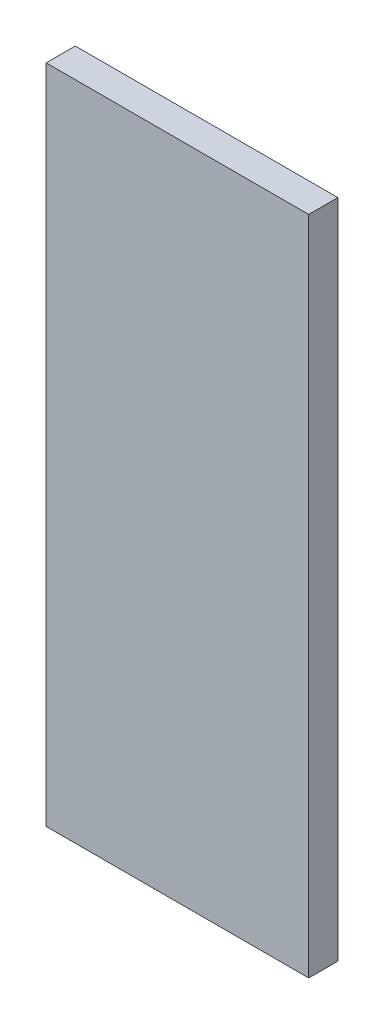
ISO-10303-21;
HEADER;
FILE_DESCRIPTION(('STEP AP214'),'2;1');
FILE_NAME('part.step','',(''),(''),'','','');
FILE_SCHEMA(('AUTOMOTIVE_DESIGN { 1 0 10303 214 1 1 1 1 }'));
ENDSEC;
DATA;
#1=APPLICATION_CONTEXT('core data for automotive mechanical design processes');
#2=APPLICATION_PROTOCOL_DEFINITION('international standard','automotive_design',2000,#1);
#3=PRODUCT_CONTEXT('',#1,'mechanical');
#4=PRODUCT('Part','Part','',(#3));
#5=PRODUCT_RELATED_PRODUCT_CATEGORY('part','',(#4));
#6=PRODUCT_DEFINITION_FORMATION('','',#4);
#7=PRODUCT_DEFINITION_CONTEXT('part definition',#1,'design');
#8=PRODUCT_DEFINITION('design','',#6,#7);
#9=PRODUCT_DEFINITION_SHAPE('','',#8);
#10=(LENGTH_UNIT() NAMED_UNIT(*) SI_UNIT(.MILLI.,.METRE.));
#11=(NAMED_UNIT(*) PLANE_ANGLE_UNIT() SI_UNIT($,.RADIAN.));
#12=(NAMED_UNIT(*) SI_UNIT($,.STERADIAN.) SOLID_ANGLE_UNIT());
#13=UNCERTAINTY_MEASURE_WITH_UNIT(LENGTH_MEASURE(1.E-05),#10,'distance_accuracy_value','');
#14=(GEOMETRIC_REPRESENTATION_CONTEXT(3) GLOBAL_UNCERTAINTY_ASSIGNED_CONTEXT((#13)) GLOBAL_UNIT_ASSIGNED_CONTEXT((#10,
#11,#12)) REPRESENTATION_CONTEXT('',''));
#15=CARTESIAN_POINT('',(0.,0.,0.));
#16=DIRECTION('',(0.,0.,1.));
#17=DIRECTION('',(1.,0.,0.));
#18=AXIS2_PLACEMENT_3D('',#15,#16,#17);
#19=CARTESIAN_POINT('',(342.900000000001,-863.599999999999,76.2));
#20=DIRECTION('',(-1.,0.,0.));
#21=DIRECTION('',(0.,0.,1.));
#22=AXIS2_PLACEMENT_3D('',#19,#20,#21);
#23=PLANE('',#22);
#24=DIRECTION('',(0.,1.,0.));
#25=VECTOR('',#24,1.);
#26=CARTESIAN_POINT('',(342.900000000001,-863.599999999999,0.));
#27=LINE('',#26,#25);
#28=CARTESIAN_POINT('',(342.900000000001,-863.599999999999,0.));
#29=VERTEX_POINT('',#28);
#30=CARTESIAN_POINT('',(342.900000000001,863.600000000001,0.));
#31=VERTEX_POINT('',#30);
#32=EDGE_CURVE('E107',#29,#31,#27,.T.);
#33=ORIENTED_EDGE('',*,*,#32,.T.);
#34=DIRECTION('',(0.,0.,-1.));
#35=VECTOR('',#34,1.);
#36=CARTESIAN_POINT('',(342.900000000001,863.600000000001,76.2));
#37=LINE('',#36,#35);
#38=CARTESIAN_POINT('',(342.900000000001,863.600000000001,76.2));
#39=VERTEX_POINT('',#38);
#40=EDGE_CURVE('E11',#39,#31,#37,.T.);
#41=ORIENTED_EDGE('',*,*,#40,.F.);
#42=DIRECTION('',(0.,1.,0.));
#43=VECTOR('',#42,1.);
#44=CARTESIAN_POINT('',(342.900000000001,-863.599999999999,76.2));
#45=LINE('',#44,#43);
#46=CARTESIAN_POINT('',(342.900000000001,-863.599999999999,76.2));
#47=VERTEX_POINT('',#46);
#48=EDGE_CURVE('E91',#47,#39,#45,.T.);
#49=ORIENTED_EDGE('',*,*,#48,.F.);
#50=DIRECTION('',(0.,0.,-1.));
#51=VECTOR('',#50,1.);
#52=CARTESIAN_POINT('',(342.900000000001,-863.599999999999,76.2));
#53=LINE('',#52,#51);
#54=EDGE_CURVE('E103',#47,#29,#53,.T.);
#55=ORIENTED_EDGE('',*,*,#54,.T.);
#56=EDGE_LOOP('',(#33,#41,#49,#55));
#57=FACE_BOUND('',#56,.T.);
#58=ADVANCED_FACE('F39',(#57),#23,.F.);
#59=CARTESIAN_POINT('',(-342.899999999999,863.600000000001,76.2));
#60=DIRECTION('',(0.,-1.,0.));
#61=DIRECTION('',(0.,0.,-1.));
#62=AXIS2_PLACEMENT_3D('',#59,#60,#61);
#63=PLANE('',#62);
#64=DIRECTION('',(-1.,0.,0.));
#65=VECTOR('',#64,1.);
#66=CARTESIAN_POINT('',(-342.899999999999,863.600000000001,0.));
#67=LINE('',#66,#65);
#68=CARTESIAN_POINT('',(-342.899999999999,863.600000000001,0.));
#69=VERTEX_POINT('',#68);
#70=EDGE_CURVE('E96',#31,#69,#67,.T.);
#71=ORIENTED_EDGE('',*,*,#70,.T.);
#72=DIRECTION('',(0.,0.,-1.));
#73=VECTOR('',#72,1.);
#74=CARTESIAN_POINT('',(-342.899999999999,863.600000000001,76.2));
#75=LINE('',#74,#73);
#76=CARTESIAN_POINT('',(-342.899999999999,863.600000000001,76.2));
#77=VERTEX_POINT('',#76);
#78=EDGE_CURVE('E48',#77,#69,#75,.T.);
#79=ORIENTED_EDGE('',*,*,#78,.F.);
#80=DIRECTION('',(-1.,0.,0.));
#81=VECTOR('',#80,1.);
#82=CARTESIAN_POINT('',(-342.899999999999,863.600000000001,76.2));
#83=LINE('',#82,#81);
#84=EDGE_CURVE('E86',#39,#77,#83,.T.);
#85=ORIENTED_EDGE('',*,*,#84,.F.);
#86=ORIENTED_EDGE('',*,*,#40,.T.);
#87=EDGE_LOOP('',(#71,#79,#85,#86));
#88=FACE_BOUND('',#87,.T.);
#89=ADVANCED_FACE('F95',(#88),#63,.F.);
#90=CARTESIAN_POINT('',(-342.899999999999,-863.599999999999,76.2));
#91=DIRECTION('',(1.,0.,0.));
#92=DIRECTION('',(0.,0.,-1.));
#93=AXIS2_PLACEMENT_3D('',#90,#91,#92);
#94=PLANE('',#93);
#95=DIRECTION('',(0.,-1.,0.));
#96=VECTOR('',#95,1.);
#97=CARTESIAN_POINT('',(-342.899999999999,-863.599999999999,0.));
#98=LINE('',#97,#96);
#99=CARTESIAN_POINT('',(-342.899999999999,-863.599999999999,0.));
#100=VERTEX_POINT('',#99);
#101=EDGE_CURVE('E73',#69,#100,#98,.T.);
#102=ORIENTED_EDGE('',*,*,#101,.T.);
#103=DIRECTION('',(0.,0.,-1.));
#104=VECTOR('',#103,1.);
#105=CARTESIAN_POINT('',(-342.899999999999,-863.599999999999,76.2));
#106=LINE('',#105,#104);
#107=CARTESIAN_POINT('',(-342.899999999999,-863.599999999999,76.2));
#108=VERTEX_POINT('',#107);
#109=EDGE_CURVE('E98',#108,#100,#106,.T.);
#110=ORIENTED_EDGE('',*,*,#109,.F.);
#111=DIRECTION('',(0.,-1.,0.));
#112=VECTOR('',#111,1.);
#113=CARTESIAN_POINT('',(-342.899999999999,-863.599999999999,76.2));
#114=LINE('',#113,#112);
#115=EDGE_CURVE('E89',#77,#108,#114,.T.);
#116=ORIENTED_EDGE('',*,*,#115,.F.);
#117=ORIENTED_EDGE('',*,*,#78,.T.);
#118=EDGE_LOOP('',(#102,#110,#116,#117));
#119=FACE_BOUND('',#118,.T.);
#120=ADVANCED_FACE('F99',(#119),#94,.F.);
#121=CARTESIAN_POINT('',(-342.899999999999,-863.599999999999,76.2));
#122=DIRECTION('',(0.,1.,0.));
#123=DIRECTION('',(0.,0.,1.));
#124=AXIS2_PLACEMENT_3D('',#121,#122,#123);
#125=PLANE('',#124);
#126=DIRECTION('',(1.,0.,0.));
#127=VECTOR('',#126,1.);
#128=CARTESIAN_POINT('',(-342.899999999999,-863.599999999999,0.));
#129=LINE('',#128,#127);
#130=EDGE_CURVE('E79',#100,#29,#129,.T.);
#131=ORIENTED_EDGE('',*,*,#130,.T.);
#132=ORIENTED_EDGE('',*,*,#54,.F.);
#133=DIRECTION('',(1.,0.,0.));
#134=VECTOR('',#133,1.);
#135=CARTESIAN_POINT('',(-342.899999999999,-863.599999999999,76.2));
#136=LINE('',#135,#134);
#137=EDGE_CURVE('E56',#108,#47,#136,.T.);
#138=ORIENTED_EDGE('',*,*,#137,.F.);
#139=ORIENTED_EDGE('',*,*,#109,.T.);
#140=EDGE_LOOP('',(#131,#132,#138,#139));
#141=FACE_BOUND('',#140,.T.);
#142=ADVANCED_FACE('F120',(#141),#125,.F.);
#143=CARTESIAN_POINT('',(0.,0.,76.2));
#144=DIRECTION('',(0.,0.,-1.));
#145=DIRECTION('',(-1.,0.,0.));
#146=AXIS2_PLACEMENT_3D('',#143,#144,#145);
#147=PLANE('',#146);
#148=ORIENTED_EDGE('',*,*,#48,.T.);
#149=ORIENTED_EDGE('',*,*,#84,.T.);
#150=ORIENTED_EDGE('',*,*,#115,.T.);
#151=ORIENTED_EDGE('',*,*,#137,.T.);
#152=EDGE_LOOP('',(#148,#149,#150,#151));
#153=FACE_BOUND('',#152,.T.);
#154=ADVANCED_FACE('F87',(#153),#147,.F.);
#155=CARTESIAN_POINT('',(0.,0.,0.));
#156=DIRECTION('',(0.,0.,-1.));
#157=DIRECTION('',(-1.,0.,0.));
#158=AXIS2_PLACEMENT_3D('',#155,#156,#157);
#159=PLANE('',#158);
#160=ORIENTED_EDGE('',*,*,#32,.F.);
#161=ORIENTED_EDGE('',*,*,#130,.F.);
#162=ORIENTED_EDGE('',*,*,#101,.F.);
#163=ORIENTED_EDGE('',*,*,#70,.F.);
#164=EDGE_LOOP('',(#160,#161,#162,#163));
#165=FACE_BOUND('',#164,.T.);
#166=ADVANCED_FACE('F123',(#165),#159,.T.);
#167=CLOSED_SHELL('',(#58,#89,#120,#142,#154,#166));
#168=MANIFOLD_SOLID_BREP('B2',#167);
#169=ADVANCED_BREP_SHAPE_REPRESENTATION('',(#18,#168),#14);
#170=SHAPE_DEFINITION_REPRESENTATION(#9,#169);
ENDSEC;
END-ISO-10303-21;
